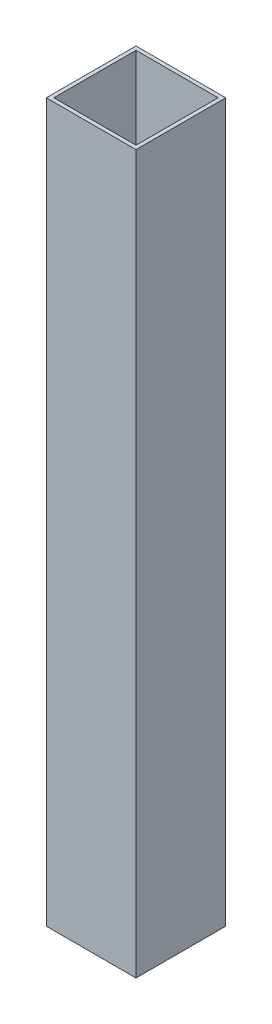
ISO-10303-21;
HEADER;
FILE_DESCRIPTION(('STEP AP214'),'2;1');
FILE_NAME('part.step','',(''),(''),'','','');
FILE_SCHEMA(('AUTOMOTIVE_DESIGN { 1 0 10303 214 1 1 1 1 }'));
ENDSEC;
DATA;
#1=APPLICATION_CONTEXT('core data for automotive mechanical design processes');
#2=APPLICATION_PROTOCOL_DEFINITION('international standard','automotive_design',2000,#1);
#3=PRODUCT_CONTEXT('',#1,'mechanical');
#4=PRODUCT('Part','Part','',(#3));
#5=PRODUCT_RELATED_PRODUCT_CATEGORY('part','',(#4));
#6=PRODUCT_DEFINITION_FORMATION('','',#4);
#7=PRODUCT_DEFINITION_CONTEXT('part definition',#1,'design');
#8=PRODUCT_DEFINITION('design','',#6,#7);
#9=PRODUCT_DEFINITION_SHAPE('','',#8);
#10=(LENGTH_UNIT() NAMED_UNIT(*) SI_UNIT(.MILLI.,.METRE.));
#11=(NAMED_UNIT(*) PLANE_ANGLE_UNIT() SI_UNIT($,.RADIAN.));
#12=(NAMED_UNIT(*) SI_UNIT($,.STERADIAN.) SOLID_ANGLE_UNIT());
#13=UNCERTAINTY_MEASURE_WITH_UNIT(LENGTH_MEASURE(1.E-05),#10,'distance_accuracy_value','');
#14=(GEOMETRIC_REPRESENTATION_CONTEXT(3) GLOBAL_UNCERTAINTY_ASSIGNED_CONTEXT((#13)) GLOBAL_UNIT_ASSIGNED_CONTEXT((#10,
#11,#12)) REPRESENTATION_CONTEXT('',''));
#15=CARTESIAN_POINT('',(0.,0.,0.));
#16=DIRECTION('',(0.,0.,1.));
#17=DIRECTION('',(1.,0.,0.));
#18=AXIS2_PLACEMENT_3D('',#15,#16,#17);
#19=CARTESIAN_POINT('',(0.,304.8,0.));
#20=DIRECTION('',(0.,-1.,0.));
#21=DIRECTION('',(0.,0.,-1.));
#22=AXIS2_PLACEMENT_3D('',#19,#20,#21);
#23=PLANE('',#22);
#24=DIRECTION('',(0.,0.,1.));
#25=VECTOR('',#24,1.);
#26=CARTESIAN_POINT('',(-19.05,304.8,-19.05));
#27=LINE('',#26,#25);
#28=CARTESIAN_POINT('',(-19.05,304.8,-19.05));
#29=VERTEX_POINT('',#28);
#30=CARTESIAN_POINT('',(-19.05,304.8,19.05));
#31=VERTEX_POINT('',#30);
#32=EDGE_CURVE('E159',#29,#31,#27,.T.);
#33=ORIENTED_EDGE('',*,*,#32,.T.);
#34=DIRECTION('',(1.,0.,0.));
#35=VECTOR('',#34,1.);
#36=CARTESIAN_POINT('',(19.05,304.8,19.05));
#37=LINE('',#36,#35);
#38=CARTESIAN_POINT('',(19.05,304.8,19.05));
#39=VERTEX_POINT('',#38);
#40=EDGE_CURVE('E163',#31,#39,#37,.T.);
#41=ORIENTED_EDGE('',*,*,#40,.T.);
#42=DIRECTION('',(0.,0.,-1.));
#43=VECTOR('',#42,1.);
#44=CARTESIAN_POINT('',(19.05,304.8,-19.05));
#45=LINE('',#44,#43);
#46=CARTESIAN_POINT('',(19.05,304.8,-19.05));
#47=VERTEX_POINT('',#46);
#48=EDGE_CURVE('E167',#39,#47,#45,.T.);
#49=ORIENTED_EDGE('',*,*,#48,.T.);
#50=DIRECTION('',(-1.,0.,0.));
#51=VECTOR('',#50,1.);
#52=CARTESIAN_POINT('',(19.05,304.8,-19.05));
#53=LINE('',#52,#51);
#54=EDGE_CURVE('E170',#47,#29,#53,.T.);
#55=ORIENTED_EDGE('',*,*,#54,.T.);
#56=EDGE_LOOP('',(#33,#41,#49,#55));
#57=FACE_BOUND('',#56,.T.);
#58=DIRECTION('',(0.,0.,-1.));
#59=VECTOR('',#58,1.);
#60=CARTESIAN_POINT('',(17.4625,304.8,-17.4625));
#61=LINE('',#60,#59);
#62=CARTESIAN_POINT('',(17.4625,304.8,17.4625));
#63=VERTEX_POINT('',#62);
#64=CARTESIAN_POINT('',(17.4625,304.8,-17.4625));
#65=VERTEX_POINT('',#64);
#66=EDGE_CURVE('E111',#63,#65,#61,.T.);
#67=ORIENTED_EDGE('',*,*,#66,.F.);
#68=DIRECTION('',(1.,0.,0.));
#69=VECTOR('',#68,1.);
#70=CARTESIAN_POINT('',(17.4625,304.8,17.4625));
#71=LINE('',#70,#69);
#72=CARTESIAN_POINT('',(-17.4625,304.8,17.4625));
#73=VERTEX_POINT('',#72);
#74=EDGE_CURVE('E137',#73,#63,#71,.T.);
#75=ORIENTED_EDGE('',*,*,#74,.F.);
#76=DIRECTION('',(0.,0.,1.));
#77=VECTOR('',#76,1.);
#78=CARTESIAN_POINT('',(-17.4625,304.8,-17.4625));
#79=LINE('',#78,#77);
#80=CARTESIAN_POINT('',(-17.4625,304.8,-17.4625));
#81=VERTEX_POINT('',#80);
#82=EDGE_CURVE('E133',#81,#73,#79,.T.);
#83=ORIENTED_EDGE('',*,*,#82,.F.);
#84=DIRECTION('',(-1.,0.,0.));
#85=VECTOR('',#84,1.);
#86=CARTESIAN_POINT('',(17.4625,304.8,-17.4625));
#87=LINE('',#86,#85);
#88=EDGE_CURVE('E120',#65,#81,#87,.T.);
#89=ORIENTED_EDGE('',*,*,#88,.F.);
#90=EDGE_LOOP('',(#67,#75,#83,#89));
#91=FACE_BOUND('',#90,.T.);
#92=ADVANCED_FACE('F45',(#57,#91),#23,.F.);
#93=CARTESIAN_POINT('',(0.,0.,0.));
#94=DIRECTION('',(0.,-1.,0.));
#95=DIRECTION('',(0.,0.,-1.));
#96=AXIS2_PLACEMENT_3D('',#93,#94,#95);
#97=PLANE('',#96);
#98=DIRECTION('',(0.,0.,1.));
#99=VECTOR('',#98,1.);
#100=CARTESIAN_POINT('',(-19.05,0.,-19.05));
#101=LINE('',#100,#99);
#102=CARTESIAN_POINT('',(-19.05,0.,-19.05));
#103=VERTEX_POINT('',#102);
#104=CARTESIAN_POINT('',(-19.05,0.,19.05));
#105=VERTEX_POINT('',#104);
#106=EDGE_CURVE('E129',#103,#105,#101,.T.);
#107=ORIENTED_EDGE('',*,*,#106,.F.);
#108=DIRECTION('',(-1.,0.,0.));
#109=VECTOR('',#108,1.);
#110=CARTESIAN_POINT('',(19.05,0.,-19.05));
#111=LINE('',#110,#109);
#112=CARTESIAN_POINT('',(19.05,0.,-19.05));
#113=VERTEX_POINT('',#112);
#114=EDGE_CURVE('E164',#113,#103,#111,.T.);
#115=ORIENTED_EDGE('',*,*,#114,.F.);
#116=DIRECTION('',(0.,0.,-1.));
#117=VECTOR('',#116,1.);
#118=CARTESIAN_POINT('',(19.05,0.,-19.05));
#119=LINE('',#118,#117);
#120=CARTESIAN_POINT('',(19.05,0.,19.05));
#121=VERTEX_POINT('',#120);
#122=EDGE_CURVE('E180',#121,#113,#119,.T.);
#123=ORIENTED_EDGE('',*,*,#122,.F.);
#124=DIRECTION('',(1.,0.,0.));
#125=VECTOR('',#124,1.);
#126=CARTESIAN_POINT('',(19.05,0.,19.05));
#127=LINE('',#126,#125);
#128=EDGE_CURVE('E177',#105,#121,#127,.T.);
#129=ORIENTED_EDGE('',*,*,#128,.F.);
#130=EDGE_LOOP('',(#107,#115,#123,#129));
#131=FACE_BOUND('',#130,.T.);
#132=DIRECTION('',(1.,0.,0.));
#133=VECTOR('',#132,1.);
#134=CARTESIAN_POINT('',(17.4625,0.,17.4625));
#135=LINE('',#134,#133);
#136=CARTESIAN_POINT('',(-17.4625,0.,17.4625));
#137=VERTEX_POINT('',#136);
#138=CARTESIAN_POINT('',(17.4625,0.,17.4625));
#139=VERTEX_POINT('',#138);
#140=EDGE_CURVE('E121',#137,#139,#135,.T.);
#141=ORIENTED_EDGE('',*,*,#140,.T.);
#142=DIRECTION('',(0.,0.,-1.));
#143=VECTOR('',#142,1.);
#144=CARTESIAN_POINT('',(17.4625,0.,-17.4625));
#145=LINE('',#144,#143);
#146=CARTESIAN_POINT('',(17.4625,0.,-17.4625));
#147=VERTEX_POINT('',#146);
#148=EDGE_CURVE('E69',#139,#147,#145,.T.);
#149=ORIENTED_EDGE('',*,*,#148,.T.);
#150=DIRECTION('',(-1.,0.,0.));
#151=VECTOR('',#150,1.);
#152=CARTESIAN_POINT('',(17.4625,0.,-17.4625));
#153=LINE('',#152,#151);
#154=CARTESIAN_POINT('',(-17.4625,0.,-17.4625));
#155=VERTEX_POINT('',#154);
#156=EDGE_CURVE('E127',#147,#155,#153,.T.);
#157=ORIENTED_EDGE('',*,*,#156,.T.);
#158=DIRECTION('',(0.,0.,1.));
#159=VECTOR('',#158,1.);
#160=CARTESIAN_POINT('',(-17.4625,0.,-17.4625));
#161=LINE('',#160,#159);
#162=EDGE_CURVE('E146',#155,#137,#161,.T.);
#163=ORIENTED_EDGE('',*,*,#162,.T.);
#164=EDGE_LOOP('',(#141,#149,#157,#163));
#165=FACE_BOUND('',#164,.T.);
#166=ADVANCED_FACE('F203',(#131,#165),#97,.T.);
#167=CARTESIAN_POINT('',(-19.05,304.8,-19.05));
#168=DIRECTION('',(1.,0.,0.));
#169=DIRECTION('',(0.,0.,-1.));
#170=AXIS2_PLACEMENT_3D('',#167,#168,#169);
#171=PLANE('',#170);
#172=ORIENTED_EDGE('',*,*,#106,.T.);
#173=DIRECTION('',(0.,-1.,0.));
#174=VECTOR('',#173,1.);
#175=CARTESIAN_POINT('',(-19.05,304.8,19.05));
#176=LINE('',#175,#174);
#177=EDGE_CURVE('E11',#31,#105,#176,.T.);
#178=ORIENTED_EDGE('',*,*,#177,.F.);
#179=ORIENTED_EDGE('',*,*,#32,.F.);
#180=DIRECTION('',(0.,-1.,0.));
#181=VECTOR('',#180,1.);
#182=CARTESIAN_POINT('',(-19.05,304.8,-19.05));
#183=LINE('',#182,#181);
#184=EDGE_CURVE('E173',#29,#103,#183,.T.);
#185=ORIENTED_EDGE('',*,*,#184,.T.);
#186=EDGE_LOOP('',(#172,#178,#179,#185));
#187=FACE_BOUND('',#186,.T.);
#188=ADVANCED_FACE('F47',(#187),#171,.F.);
#189=CARTESIAN_POINT('',(19.05,304.8,19.05));
#190=DIRECTION('',(0.,0.,-1.));
#191=DIRECTION('',(-1.,0.,0.));
#192=AXIS2_PLACEMENT_3D('',#189,#190,#191);
#193=PLANE('',#192);
#194=ORIENTED_EDGE('',*,*,#128,.T.);
#195=DIRECTION('',(0.,-1.,0.));
#196=VECTOR('',#195,1.);
#197=CARTESIAN_POINT('',(19.05,304.8,19.05));
#198=LINE('',#197,#196);
#199=EDGE_CURVE('E54',#39,#121,#198,.T.);
#200=ORIENTED_EDGE('',*,*,#199,.F.);
#201=ORIENTED_EDGE('',*,*,#40,.F.);
#202=ORIENTED_EDGE('',*,*,#177,.T.);
#203=EDGE_LOOP('',(#194,#200,#201,#202));
#204=FACE_BOUND('',#203,.T.);
#205=ADVANCED_FACE('F213',(#204),#193,.F.);
#206=CARTESIAN_POINT('',(19.05,304.8,-19.05));
#207=DIRECTION('',(-1.,0.,0.));
#208=DIRECTION('',(0.,0.,1.));
#209=AXIS2_PLACEMENT_3D('',#206,#207,#208);
#210=PLANE('',#209);
#211=ORIENTED_EDGE('',*,*,#122,.T.);
#212=DIRECTION('',(0.,-1.,0.));
#213=VECTOR('',#212,1.);
#214=CARTESIAN_POINT('',(19.05,304.8,-19.05));
#215=LINE('',#214,#213);
#216=EDGE_CURVE('E188',#47,#113,#215,.T.);
#217=ORIENTED_EDGE('',*,*,#216,.F.);
#218=ORIENTED_EDGE('',*,*,#48,.F.);
#219=ORIENTED_EDGE('',*,*,#199,.T.);
#220=EDGE_LOOP('',(#211,#217,#218,#219));
#221=FACE_BOUND('',#220,.T.);
#222=ADVANCED_FACE('F197',(#221),#210,.F.);
#223=CARTESIAN_POINT('',(19.05,304.8,-19.05));
#224=DIRECTION('',(0.,0.,1.));
#225=DIRECTION('',(1.,0.,0.));
#226=AXIS2_PLACEMENT_3D('',#223,#224,#225);
#227=PLANE('',#226);
#228=ORIENTED_EDGE('',*,*,#114,.T.);
#229=ORIENTED_EDGE('',*,*,#184,.F.);
#230=ORIENTED_EDGE('',*,*,#54,.F.);
#231=ORIENTED_EDGE('',*,*,#216,.T.);
#232=EDGE_LOOP('',(#228,#229,#230,#231));
#233=FACE_BOUND('',#232,.T.);
#234=ADVANCED_FACE('F207',(#233),#227,.F.);
#235=CARTESIAN_POINT('',(17.4625,304.8,-17.4625));
#236=DIRECTION('',(-1.,0.,0.));
#237=DIRECTION('',(0.,0.,1.));
#238=AXIS2_PLACEMENT_3D('',#235,#236,#237);
#239=PLANE('',#238);
#240=ORIENTED_EDGE('',*,*,#148,.F.);
#241=DIRECTION('',(0.,-1.,0.));
#242=VECTOR('',#241,1.);
#243=CARTESIAN_POINT('',(17.4625,304.8,17.4625));
#244=LINE('',#243,#242);
#245=EDGE_CURVE('E115',#63,#139,#244,.T.);
#246=ORIENTED_EDGE('',*,*,#245,.F.);
#247=ORIENTED_EDGE('',*,*,#66,.T.);
#248=DIRECTION('',(0.,-1.,0.));
#249=VECTOR('',#248,1.);
#250=CARTESIAN_POINT('',(17.4625,304.8,-17.4625));
#251=LINE('',#250,#249);
#252=EDGE_CURVE('E114',#65,#147,#251,.T.);
#253=ORIENTED_EDGE('',*,*,#252,.T.);
#254=EDGE_LOOP('',(#240,#246,#247,#253));
#255=FACE_BOUND('',#254,.T.);
#256=ADVANCED_FACE('F113',(#255),#239,.T.);
#257=CARTESIAN_POINT('',(17.4625,304.8,-17.4625));
#258=DIRECTION('',(0.,0.,1.));
#259=DIRECTION('',(1.,0.,0.));
#260=AXIS2_PLACEMENT_3D('',#257,#258,#259);
#261=PLANE('',#260);
#262=ORIENTED_EDGE('',*,*,#156,.F.);
#263=ORIENTED_EDGE('',*,*,#252,.F.);
#264=ORIENTED_EDGE('',*,*,#88,.T.);
#265=DIRECTION('',(0.,-1.,0.));
#266=VECTOR('',#265,1.);
#267=CARTESIAN_POINT('',(-17.4625,304.8,-17.4625));
#268=LINE('',#267,#266);
#269=EDGE_CURVE('E130',#81,#155,#268,.T.);
#270=ORIENTED_EDGE('',*,*,#269,.T.);
#271=EDGE_LOOP('',(#262,#263,#264,#270));
#272=FACE_BOUND('',#271,.T.);
#273=ADVANCED_FACE('F124',(#272),#261,.T.);
#274=CARTESIAN_POINT('',(-17.4625,304.8,-17.4625));
#275=DIRECTION('',(1.,0.,0.));
#276=DIRECTION('',(0.,0.,-1.));
#277=AXIS2_PLACEMENT_3D('',#274,#275,#276);
#278=PLANE('',#277);
#279=ORIENTED_EDGE('',*,*,#162,.F.);
#280=ORIENTED_EDGE('',*,*,#269,.F.);
#281=ORIENTED_EDGE('',*,*,#82,.T.);
#282=DIRECTION('',(0.,-1.,0.));
#283=VECTOR('',#282,1.);
#284=CARTESIAN_POINT('',(-17.4625,304.8,17.4625));
#285=LINE('',#284,#283);
#286=EDGE_CURVE('E61',#73,#137,#285,.T.);
#287=ORIENTED_EDGE('',*,*,#286,.T.);
#288=EDGE_LOOP('',(#279,#280,#281,#287));
#289=FACE_BOUND('',#288,.T.);
#290=ADVANCED_FACE('F236',(#289),#278,.T.);
#291=CARTESIAN_POINT('',(17.4625,304.8,17.4625));
#292=DIRECTION('',(0.,0.,-1.));
#293=DIRECTION('',(-1.,0.,0.));
#294=AXIS2_PLACEMENT_3D('',#291,#292,#293);
#295=PLANE('',#294);
#296=ORIENTED_EDGE('',*,*,#140,.F.);
#297=ORIENTED_EDGE('',*,*,#286,.F.);
#298=ORIENTED_EDGE('',*,*,#74,.T.);
#299=ORIENTED_EDGE('',*,*,#245,.T.);
#300=EDGE_LOOP('',(#296,#297,#298,#299));
#301=FACE_BOUND('',#300,.T.);
#302=ADVANCED_FACE('F240',(#301),#295,.T.);
#303=CLOSED_SHELL('',(#92,#166,#188,#205,#222,#234,#256,#273,#290,#302));
#304=MANIFOLD_SOLID_BREP('B2',#303);
#305=ADVANCED_BREP_SHAPE_REPRESENTATION('',(#18,#304),#14);
#306=SHAPE_DEFINITION_REPRESENTATION(#9,#305);
ENDSEC;
END-ISO-10303-21;
